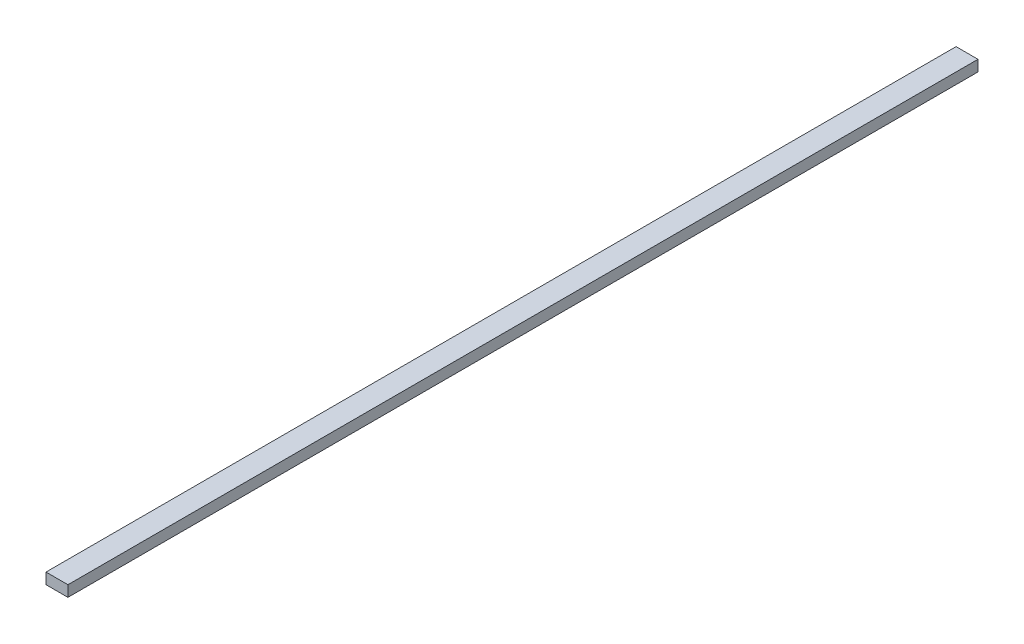
ISO-10303-21;
HEADER;
FILE_DESCRIPTION(('STEP AP214'),'2;1');
FILE_NAME('part.step','',(''),(''),'','','');
FILE_SCHEMA(('AUTOMOTIVE_DESIGN { 1 0 10303 214 1 1 1 1 }'));
ENDSEC;
DATA;
#1=APPLICATION_CONTEXT('core data for automotive mechanical design processes');
#2=APPLICATION_PROTOCOL_DEFINITION('international standard','automotive_design',2000,#1);
#3=PRODUCT_CONTEXT('',#1,'mechanical');
#4=PRODUCT('Part','Part','',(#3));
#5=PRODUCT_RELATED_PRODUCT_CATEGORY('part','',(#4));
#6=PRODUCT_DEFINITION_FORMATION('','',#4);
#7=PRODUCT_DEFINITION_CONTEXT('part definition',#1,'design');
#8=PRODUCT_DEFINITION('design','',#6,#7);
#9=PRODUCT_DEFINITION_SHAPE('','',#8);
#10=(LENGTH_UNIT() NAMED_UNIT(*) SI_UNIT(.MILLI.,.METRE.));
#11=(NAMED_UNIT(*) PLANE_ANGLE_UNIT() SI_UNIT($,.RADIAN.));
#12=(NAMED_UNIT(*) SI_UNIT($,.STERADIAN.) SOLID_ANGLE_UNIT());
#13=UNCERTAINTY_MEASURE_WITH_UNIT(LENGTH_MEASURE(1.E-05),#10,'distance_accuracy_value','');
#14=(GEOMETRIC_REPRESENTATION_CONTEXT(3) GLOBAL_UNCERTAINTY_ASSIGNED_CONTEXT((#13)) GLOBAL_UNIT_ASSIGNED_CONTEXT((#10,
#11,#12)) REPRESENTATION_CONTEXT('',''));
#15=CARTESIAN_POINT('',(0.,0.,0.));
#16=DIRECTION('',(0.,0.,1.));
#17=DIRECTION('',(1.,0.,0.));
#18=AXIS2_PLACEMENT_3D('',#15,#16,#17);
#19=CARTESIAN_POINT('',(-6.35,-3.175,527.05));
#20=DIRECTION('',(1.,0.,0.));
#21=DIRECTION('',(0.,0.,-1.));
#22=AXIS2_PLACEMENT_3D('',#19,#20,#21);
#23=PLANE('',#22);
#24=DIRECTION('',(0.,-1.,0.));
#25=VECTOR('',#24,1.);
#26=CARTESIAN_POINT('',(-6.35,-3.175,0.));
#27=LINE('',#26,#25);
#28=CARTESIAN_POINT('',(-6.35,3.175,0.));
#29=VERTEX_POINT('',#28);
#30=CARTESIAN_POINT('',(-6.35,-3.175,0.));
#31=VERTEX_POINT('',#30);
#32=EDGE_CURVE('E107',#29,#31,#27,.T.);
#33=ORIENTED_EDGE('',*,*,#32,.T.);
#34=DIRECTION('',(0.,0.,-1.));
#35=VECTOR('',#34,1.);
#36=CARTESIAN_POINT('',(-6.35,-3.175,527.05));
#37=LINE('',#36,#35);
#38=CARTESIAN_POINT('',(-6.35,-3.175,527.05));
#39=VERTEX_POINT('',#38);
#40=EDGE_CURVE('E11',#39,#31,#37,.T.);
#41=ORIENTED_EDGE('',*,*,#40,.F.);
#42=DIRECTION('',(0.,-1.,0.));
#43=VECTOR('',#42,1.);
#44=CARTESIAN_POINT('',(-6.35,-3.175,527.05));
#45=LINE('',#44,#43);
#46=CARTESIAN_POINT('',(-6.35,3.175,527.05));
#47=VERTEX_POINT('',#46);
#48=EDGE_CURVE('E91',#47,#39,#45,.T.);
#49=ORIENTED_EDGE('',*,*,#48,.F.);
#50=DIRECTION('',(0.,0.,-1.));
#51=VECTOR('',#50,1.);
#52=CARTESIAN_POINT('',(-6.35,3.175,527.05));
#53=LINE('',#52,#51);
#54=EDGE_CURVE('E103',#47,#29,#53,.T.);
#55=ORIENTED_EDGE('',*,*,#54,.T.);
#56=EDGE_LOOP('',(#33,#41,#49,#55));
#57=FACE_BOUND('',#56,.T.);
#58=ADVANCED_FACE('F39',(#57),#23,.F.);
#59=CARTESIAN_POINT('',(6.35,-3.175,527.05));
#60=DIRECTION('',(0.,1.,0.));
#61=DIRECTION('',(-1.,0.,0.));
#62=AXIS2_PLACEMENT_3D('',#59,#60,#61);
#63=PLANE('',#62);
#64=DIRECTION('',(1.,0.,0.));
#65=VECTOR('',#64,1.);
#66=CARTESIAN_POINT('',(6.35,-3.175,0.));
#67=LINE('',#66,#65);
#68=CARTESIAN_POINT('',(6.35,-3.175,0.));
#69=VERTEX_POINT('',#68);
#70=EDGE_CURVE('E96',#31,#69,#67,.T.);
#71=ORIENTED_EDGE('',*,*,#70,.T.);
#72=DIRECTION('',(0.,0.,-1.));
#73=VECTOR('',#72,1.);
#74=CARTESIAN_POINT('',(6.35,-3.175,527.05));
#75=LINE('',#74,#73);
#76=CARTESIAN_POINT('',(6.35,-3.175,527.05));
#77=VERTEX_POINT('',#76);
#78=EDGE_CURVE('E48',#77,#69,#75,.T.);
#79=ORIENTED_EDGE('',*,*,#78,.F.);
#80=DIRECTION('',(1.,0.,0.));
#81=VECTOR('',#80,1.);
#82=CARTESIAN_POINT('',(6.35,-3.175,527.05));
#83=LINE('',#82,#81);
#84=EDGE_CURVE('E86',#39,#77,#83,.T.);
#85=ORIENTED_EDGE('',*,*,#84,.F.);
#86=ORIENTED_EDGE('',*,*,#40,.T.);
#87=EDGE_LOOP('',(#71,#79,#85,#86));
#88=FACE_BOUND('',#87,.T.);
#89=ADVANCED_FACE('F95',(#88),#63,.F.);
#90=CARTESIAN_POINT('',(6.35,-3.175,527.05));
#91=DIRECTION('',(-1.,0.,0.));
#92=DIRECTION('',(0.,-1.,0.));
#93=AXIS2_PLACEMENT_3D('',#90,#91,#92);
#94=PLANE('',#93);
#95=DIRECTION('',(0.,1.,0.));
#96=VECTOR('',#95,1.);
#97=CARTESIAN_POINT('',(6.35,-3.175,0.));
#98=LINE('',#97,#96);
#99=CARTESIAN_POINT('',(6.35,3.175,0.));
#100=VERTEX_POINT('',#99);
#101=EDGE_CURVE('E73',#69,#100,#98,.T.);
#102=ORIENTED_EDGE('',*,*,#101,.T.);
#103=DIRECTION('',(0.,0.,-1.));
#104=VECTOR('',#103,1.);
#105=CARTESIAN_POINT('',(6.35,3.175,527.05));
#106=LINE('',#105,#104);
#107=CARTESIAN_POINT('',(6.35,3.175,527.05));
#108=VERTEX_POINT('',#107);
#109=EDGE_CURVE('E98',#108,#100,#106,.T.);
#110=ORIENTED_EDGE('',*,*,#109,.F.);
#111=DIRECTION('',(0.,1.,0.));
#112=VECTOR('',#111,1.);
#113=CARTESIAN_POINT('',(6.35,-3.175,527.05));
#114=LINE('',#113,#112);
#115=EDGE_CURVE('E89',#77,#108,#114,.T.);
#116=ORIENTED_EDGE('',*,*,#115,.F.);
#117=ORIENTED_EDGE('',*,*,#78,.T.);
#118=EDGE_LOOP('',(#102,#110,#116,#117));
#119=FACE_BOUND('',#118,.T.);
#120=ADVANCED_FACE('F99',(#119),#94,.F.);
#121=CARTESIAN_POINT('',(6.35,3.175,527.05));
#122=DIRECTION('',(0.,-1.,0.));
#123=DIRECTION('',(1.,0.,0.));
#124=AXIS2_PLACEMENT_3D('',#121,#122,#123);
#125=PLANE('',#124);
#126=DIRECTION('',(-1.,0.,0.));
#127=VECTOR('',#126,1.);
#128=CARTESIAN_POINT('',(6.35,3.175,0.));
#129=LINE('',#128,#127);
#130=EDGE_CURVE('E79',#100,#29,#129,.T.);
#131=ORIENTED_EDGE('',*,*,#130,.T.);
#132=ORIENTED_EDGE('',*,*,#54,.F.);
#133=DIRECTION('',(-1.,0.,0.));
#134=VECTOR('',#133,1.);
#135=CARTESIAN_POINT('',(6.35,3.175,527.05));
#136=LINE('',#135,#134);
#137=EDGE_CURVE('E56',#108,#47,#136,.T.);
#138=ORIENTED_EDGE('',*,*,#137,.F.);
#139=ORIENTED_EDGE('',*,*,#109,.T.);
#140=EDGE_LOOP('',(#131,#132,#138,#139));
#141=FACE_BOUND('',#140,.T.);
#142=ADVANCED_FACE('F120',(#141),#125,.F.);
#143=CARTESIAN_POINT('',(0.,0.,527.05));
#144=DIRECTION('',(0.,0.,1.));
#145=DIRECTION('',(1.,0.,0.));
#146=AXIS2_PLACEMENT_3D('',#143,#144,#145);
#147=PLANE('',#146);
#148=ORIENTED_EDGE('',*,*,#48,.T.);
#149=ORIENTED_EDGE('',*,*,#84,.T.);
#150=ORIENTED_EDGE('',*,*,#115,.T.);
#151=ORIENTED_EDGE('',*,*,#137,.T.);
#152=EDGE_LOOP('',(#148,#149,#150,#151));
#153=FACE_BOUND('',#152,.T.);
#154=ADVANCED_FACE('F87',(#153),#147,.T.);
#155=CARTESIAN_POINT('',(0.,0.,0.));
#156=DIRECTION('',(0.,0.,1.));
#157=DIRECTION('',(1.,0.,0.));
#158=AXIS2_PLACEMENT_3D('',#155,#156,#157);
#159=PLANE('',#158);
#160=ORIENTED_EDGE('',*,*,#32,.F.);
#161=ORIENTED_EDGE('',*,*,#130,.F.);
#162=ORIENTED_EDGE('',*,*,#101,.F.);
#163=ORIENTED_EDGE('',*,*,#70,.F.);
#164=EDGE_LOOP('',(#160,#161,#162,#163));
#165=FACE_BOUND('',#164,.T.);
#166=ADVANCED_FACE('F123',(#165),#159,.F.);
#167=CLOSED_SHELL('',(#58,#89,#120,#142,#154,#166));
#168=MANIFOLD_SOLID_BREP('B2',#167);
#169=ADVANCED_BREP_SHAPE_REPRESENTATION('',(#18,#168),#14);
#170=SHAPE_DEFINITION_REPRESENTATION(#9,#169);
ENDSEC;
END-ISO-10303-21;
